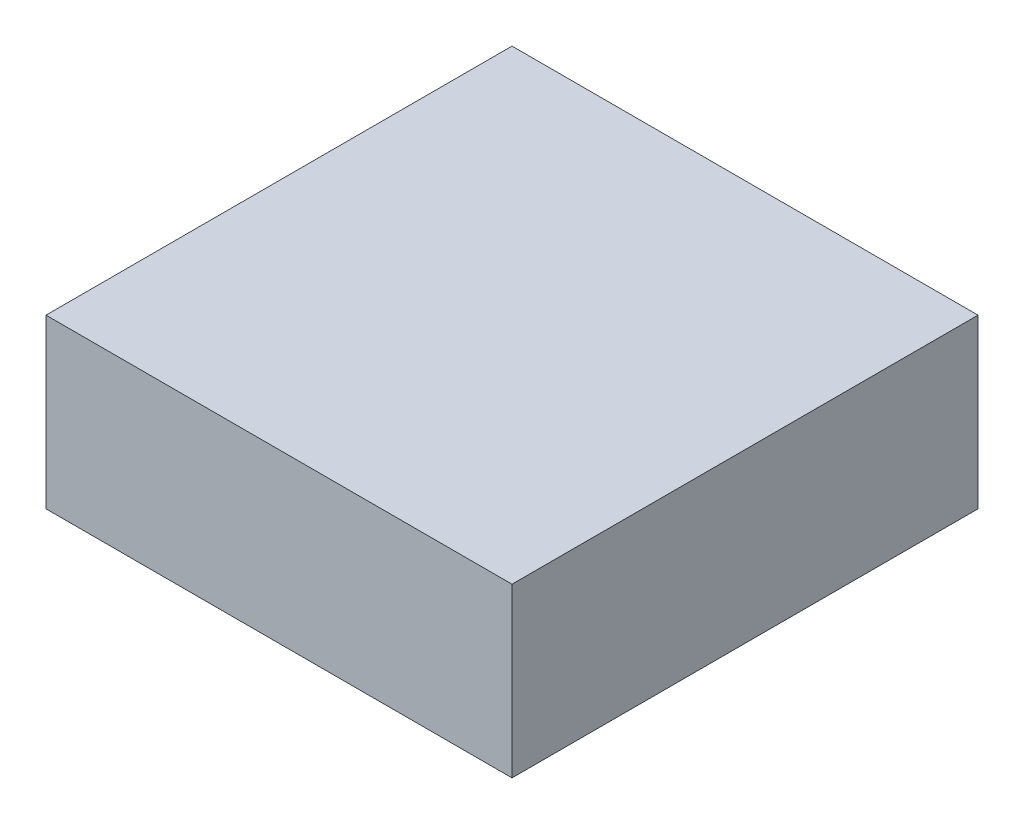
ISO-10303-21;
HEADER;
FILE_DESCRIPTION(('STEP AP214'),'2;1');
FILE_NAME('part.step','',(''),(''),'','','');
FILE_SCHEMA(('AUTOMOTIVE_DESIGN { 1 0 10303 214 1 1 1 1 }'));
ENDSEC;
DATA;
#1=APPLICATION_CONTEXT('core data for automotive mechanical design processes');
#2=APPLICATION_PROTOCOL_DEFINITION('international standard','automotive_design',2000,#1);
#3=PRODUCT_CONTEXT('',#1,'mechanical');
#4=PRODUCT('Part','Part','',(#3));
#5=PRODUCT_RELATED_PRODUCT_CATEGORY('part','',(#4));
#6=PRODUCT_DEFINITION_FORMATION('','',#4);
#7=PRODUCT_DEFINITION_CONTEXT('part definition',#1,'design');
#8=PRODUCT_DEFINITION('design','',#6,#7);
#9=PRODUCT_DEFINITION_SHAPE('','',#8);
#10=(LENGTH_UNIT() NAMED_UNIT(*) SI_UNIT(.MILLI.,.METRE.));
#11=(NAMED_UNIT(*) PLANE_ANGLE_UNIT() SI_UNIT($,.RADIAN.));
#12=(NAMED_UNIT(*) SI_UNIT($,.STERADIAN.) SOLID_ANGLE_UNIT());
#13=UNCERTAINTY_MEASURE_WITH_UNIT(LENGTH_MEASURE(1.E-05),#10,'distance_accuracy_value','');
#14=(GEOMETRIC_REPRESENTATION_CONTEXT(3) GLOBAL_UNCERTAINTY_ASSIGNED_CONTEXT((#13)) GLOBAL_UNIT_ASSIGNED_CONTEXT((#10,
#11,#12)) REPRESENTATION_CONTEXT('',''));
#15=CARTESIAN_POINT('',(0.,0.,0.));
#16=DIRECTION('',(0.,0.,1.));
#17=DIRECTION('',(1.,0.,0.));
#18=AXIS2_PLACEMENT_3D('',#15,#16,#17);
#19=CARTESIAN_POINT('',(4.48935,3.2456,1.104925));
#20=DIRECTION('',(0.,1.,0.));
#21=DIRECTION('',(1.,0.,0.));
#22=AXIS2_PLACEMENT_3D('',#19,#20,#21);
#23=PLANE('',#22);
#24=DIRECTION('',(0.,0.,-1.));
#25=VECTOR('',#24,1.);
#26=CARTESIAN_POINT('',(6.43935,3.2456,1.104925));
#27=LINE('',#26,#25);
#28=CARTESIAN_POINT('',(6.43935,3.2456,1.479925));
#29=VERTEX_POINT('',#28);
#30=CARTESIAN_POINT('',(6.43935,3.2456,0.729924999999953));
#31=VERTEX_POINT('',#30);
#32=EDGE_CURVE('E11',#29,#31,#27,.T.);
#33=ORIENTED_EDGE('',*,*,#32,.T.);
#34=DIRECTION('',(-1.,0.,0.));
#35=VECTOR('',#34,1.);
#36=CARTESIAN_POINT('',(4.48935,3.2456,0.729924999999953));
#37=LINE('',#36,#35);
#38=CARTESIAN_POINT('',(5.68935,3.2456,0.729924999999953));
#39=VERTEX_POINT('',#38);
#40=EDGE_CURVE('E24',#31,#39,#37,.T.);
#41=ORIENTED_EDGE('',*,*,#40,.T.);
#42=DIRECTION('',(0.,0.,1.));
#43=VECTOR('',#42,1.);
#44=CARTESIAN_POINT('',(5.68935,3.2456,1.104925));
#45=LINE('',#44,#43);
#46=CARTESIAN_POINT('',(5.68935,3.2456,1.479925));
#47=VERTEX_POINT('',#46);
#48=EDGE_CURVE('E88',#39,#47,#45,.T.);
#49=ORIENTED_EDGE('',*,*,#48,.T.);
#50=DIRECTION('',(1.,0.,0.));
#51=VECTOR('',#50,1.);
#52=CARTESIAN_POINT('',(4.48935,3.2456,1.479925));
#53=LINE('',#52,#51);
#54=EDGE_CURVE('E69',#47,#29,#53,.T.);
#55=ORIENTED_EDGE('',*,*,#54,.T.);
#56=EDGE_LOOP('',(#33,#41,#49,#55));
#57=FACE_BOUND('',#56,.T.);
#58=ADVANCED_FACE('F17',(#57),#23,.T.);
#59=CARTESIAN_POINT('',(6.06435,2.9756,0.729924999999953));
#60=DIRECTION('',(0.,0.,-1.));
#61=DIRECTION('',(0.,1.,0.));
#62=AXIS2_PLACEMENT_3D('',#59,#60,#61);
#63=PLANE('',#62);
#64=DIRECTION('',(-1.,0.,0.));
#65=VECTOR('',#64,1.);
#66=CARTESIAN_POINT('',(6.06435,2.9756,0.729924999999952));
#67=LINE('',#66,#65);
#68=CARTESIAN_POINT('',(6.43935,2.9756,0.729924999999952));
#69=VERTEX_POINT('',#68);
#70=CARTESIAN_POINT('',(5.68935,2.9756,0.729924999999952));
#71=VERTEX_POINT('',#70);
#72=EDGE_CURVE('E85',#69,#71,#67,.T.);
#73=ORIENTED_EDGE('',*,*,#72,.T.);
#74=DIRECTION('',(0.,1.,0.));
#75=VECTOR('',#74,1.);
#76=CARTESIAN_POINT('',(5.68935,2.9756,0.729924999999952));
#77=LINE('',#76,#75);
#78=EDGE_CURVE('E76',#71,#39,#77,.T.);
#79=ORIENTED_EDGE('',*,*,#78,.T.);
#80=ORIENTED_EDGE('',*,*,#40,.F.);
#81=DIRECTION('',(0.,-1.,0.));
#82=VECTOR('',#81,1.);
#83=CARTESIAN_POINT('',(6.43935,2.9756,0.729924999999952));
#84=LINE('',#83,#82);
#85=EDGE_CURVE('E81',#31,#69,#84,.T.);
#86=ORIENTED_EDGE('',*,*,#85,.T.);
#87=EDGE_LOOP('',(#73,#79,#80,#86));
#88=FACE_BOUND('',#87,.T.);
#89=ADVANCED_FACE('F90',(#88),#63,.T.);
#90=CARTESIAN_POINT('',(6.43935,2.9756,1.104925));
#91=DIRECTION('',(1.,0.,0.));
#92=DIRECTION('',(0.,-1.,0.));
#93=AXIS2_PLACEMENT_3D('',#90,#91,#92);
#94=PLANE('',#93);
#95=DIRECTION('',(0.,0.,-1.));
#96=VECTOR('',#95,1.);
#97=CARTESIAN_POINT('',(6.43935,2.9756,1.104925));
#98=LINE('',#97,#96);
#99=CARTESIAN_POINT('',(6.43935,2.9756,1.479925));
#100=VERTEX_POINT('',#99);
#101=EDGE_CURVE('E60',#100,#69,#98,.T.);
#102=ORIENTED_EDGE('',*,*,#101,.T.);
#103=ORIENTED_EDGE('',*,*,#85,.F.);
#104=ORIENTED_EDGE('',*,*,#32,.F.);
#105=DIRECTION('',(0.,-1.,0.));
#106=VECTOR('',#105,1.);
#107=CARTESIAN_POINT('',(6.43935,2.9756,1.479925));
#108=LINE('',#107,#106);
#109=EDGE_CURVE('E63',#29,#100,#108,.T.);
#110=ORIENTED_EDGE('',*,*,#109,.T.);
#111=EDGE_LOOP('',(#102,#103,#104,#110));
#112=FACE_BOUND('',#111,.T.);
#113=ADVANCED_FACE('F91',(#112),#94,.T.);
#114=CARTESIAN_POINT('',(6.06435,2.9756,1.479925));
#115=DIRECTION('',(0.,0.,1.));
#116=DIRECTION('',(0.,-1.,0.));
#117=AXIS2_PLACEMENT_3D('',#114,#115,#116);
#118=PLANE('',#117);
#119=DIRECTION('',(1.,0.,0.));
#120=VECTOR('',#119,1.);
#121=CARTESIAN_POINT('',(6.06435,2.9756,1.479925));
#122=LINE('',#121,#120);
#123=CARTESIAN_POINT('',(5.68935,2.9756,1.479925));
#124=VERTEX_POINT('',#123);
#125=EDGE_CURVE('E54',#124,#100,#122,.T.);
#126=ORIENTED_EDGE('',*,*,#125,.T.);
#127=ORIENTED_EDGE('',*,*,#109,.F.);
#128=ORIENTED_EDGE('',*,*,#54,.F.);
#129=DIRECTION('',(0.,-1.,0.));
#130=VECTOR('',#129,1.);
#131=CARTESIAN_POINT('',(5.68935,2.9756,1.479925));
#132=LINE('',#131,#130);
#133=EDGE_CURVE('E64',#47,#124,#132,.T.);
#134=ORIENTED_EDGE('',*,*,#133,.T.);
#135=EDGE_LOOP('',(#126,#127,#128,#134));
#136=FACE_BOUND('',#135,.T.);
#137=ADVANCED_FACE('F68',(#136),#118,.T.);
#138=CARTESIAN_POINT('',(5.68935,2.9756,1.104925));
#139=DIRECTION('',(-1.,0.,0.));
#140=DIRECTION('',(0.,1.,0.));
#141=AXIS2_PLACEMENT_3D('',#138,#139,#140);
#142=PLANE('',#141);
#143=DIRECTION('',(0.,0.,1.));
#144=VECTOR('',#143,1.);
#145=CARTESIAN_POINT('',(5.68935,2.9756,1.104925));
#146=LINE('',#145,#144);
#147=EDGE_CURVE('E58',#71,#124,#146,.T.);
#148=ORIENTED_EDGE('',*,*,#147,.T.);
#149=ORIENTED_EDGE('',*,*,#133,.F.);
#150=ORIENTED_EDGE('',*,*,#48,.F.);
#151=ORIENTED_EDGE('',*,*,#78,.F.);
#152=EDGE_LOOP('',(#148,#149,#150,#151));
#153=FACE_BOUND('',#152,.T.);
#154=ADVANCED_FACE('F74',(#153),#142,.T.);
#155=CARTESIAN_POINT('',(4.48935,2.9756,1.104925));
#156=DIRECTION('',(0.,1.,0.));
#157=DIRECTION('',(1.,0.,0.));
#158=AXIS2_PLACEMENT_3D('',#155,#156,#157);
#159=PLANE('',#158);
#160=ORIENTED_EDGE('',*,*,#147,.F.);
#161=ORIENTED_EDGE('',*,*,#72,.F.);
#162=ORIENTED_EDGE('',*,*,#101,.F.);
#163=ORIENTED_EDGE('',*,*,#125,.F.);
#164=EDGE_LOOP('',(#160,#161,#162,#163));
#165=FACE_BOUND('',#164,.T.);
#166=ADVANCED_FACE('F56',(#165),#159,.F.);
#167=CLOSED_SHELL('',(#58,#89,#113,#137,#154,#166));
#168=MANIFOLD_SOLID_BREP('B1',#167);
#169=ADVANCED_BREP_SHAPE_REPRESENTATION('',(#18,#168),#14);
#170=SHAPE_DEFINITION_REPRESENTATION(#9,#169);
ENDSEC;
END-ISO-10303-21;
